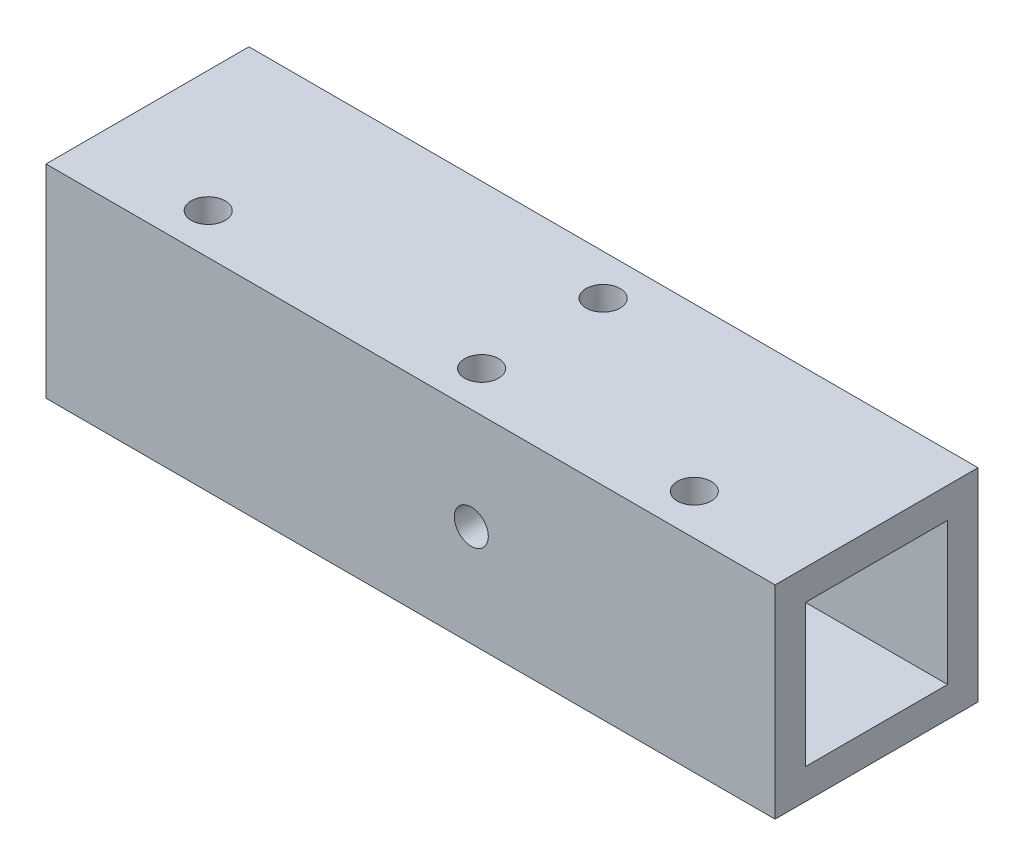
ISO-10303-21;
HEADER;
FILE_DESCRIPTION(('STEP AP214'),'2;1');
FILE_NAME('part.step','',(''),(''),'','','');
FILE_SCHEMA(('AUTOMOTIVE_DESIGN { 1 0 10303 214 1 1 1 1 }'));
ENDSEC;
DATA;
#1=APPLICATION_CONTEXT('core data for automotive mechanical design processes');
#2=APPLICATION_PROTOCOL_DEFINITION('international standard','automotive_design',2000,#1);
#3=PRODUCT_CONTEXT('',#1,'mechanical');
#4=PRODUCT('Part','Part','',(#3));
#5=PRODUCT_RELATED_PRODUCT_CATEGORY('part','',(#4));
#6=PRODUCT_DEFINITION_FORMATION('','',#4);
#7=PRODUCT_DEFINITION_CONTEXT('part definition',#1,'design');
#8=PRODUCT_DEFINITION('design','',#6,#7);
#9=PRODUCT_DEFINITION_SHAPE('','',#8);
#10=(LENGTH_UNIT() NAMED_UNIT(*) SI_UNIT(.MILLI.,.METRE.));
#11=(NAMED_UNIT(*) PLANE_ANGLE_UNIT() SI_UNIT($,.RADIAN.));
#12=(NAMED_UNIT(*) SI_UNIT($,.STERADIAN.) SOLID_ANGLE_UNIT());
#13=UNCERTAINTY_MEASURE_WITH_UNIT(LENGTH_MEASURE(1.E-05),#10,'distance_accuracy_value','');
#14=(GEOMETRIC_REPRESENTATION_CONTEXT(3) GLOBAL_UNCERTAINTY_ASSIGNED_CONTEXT((#13)) GLOBAL_UNIT_ASSIGNED_CONTEXT((#10,
#11,#12)) REPRESENTATION_CONTEXT('',''));
#15=CARTESIAN_POINT('',(0.,0.,0.));
#16=DIRECTION('',(0.,0.,1.));
#17=DIRECTION('',(1.,0.,0.));
#18=AXIS2_PLACEMENT_3D('',#15,#16,#17);
#19=CARTESIAN_POINT('',(29.,110.3,131.7));
#20=DIRECTION('',(0.,0.,1.));
#21=DIRECTION('',(1.,0.,0.));
#22=AXIS2_PLACEMENT_3D('',#19,#20,#21);
#23=PLANE('',#22);
#24=DIRECTION('',(0.,-1.,0.));
#25=VECTOR('',#24,1.);
#26=CARTESIAN_POINT('',(92.775140453871,144.,131.7));
#27=LINE('',#26,#25);
#28=CARTESIAN_POINT('',(92.77514045387,133.7,131.7));
#29=VERTEX_POINT('',#28);
#30=CARTESIAN_POINT('',(92.77514045387,110.3,131.7));
#31=VERTEX_POINT('',#30);
#32=EDGE_CURVE('E382',#29,#31,#27,.T.);
#33=ORIENTED_EDGE('',*,*,#32,.T.);
#34=DIRECTION('',(1.,0.,0.));
#35=VECTOR('',#34,1.);
#36=CARTESIAN_POINT('',(29.,110.3,131.7));
#37=LINE('',#36,#35);
#38=CARTESIAN_POINT('',(52.22485954613,110.3,131.7));
#39=VERTEX_POINT('',#38);
#40=EDGE_CURVE('E335',#39,#31,#37,.T.);
#41=ORIENTED_EDGE('',*,*,#40,.F.);
#42=DIRECTION('',(0.,-1.,0.));
#43=VECTOR('',#42,1.);
#44=CARTESIAN_POINT('',(52.224859546129,144.,131.7));
#45=LINE('',#44,#43);
#46=CARTESIAN_POINT('',(52.22485954613,133.7,131.7));
#47=VERTEX_POINT('',#46);
#48=EDGE_CURVE('E444',#47,#39,#45,.T.);
#49=ORIENTED_EDGE('',*,*,#48,.F.);
#50=DIRECTION('',(1.,0.,0.));
#51=VECTOR('',#50,1.);
#52=CARTESIAN_POINT('',(29.,133.7,131.7));
#53=LINE('',#52,#51);
#54=EDGE_CURVE('E354',#47,#29,#53,.T.);
#55=ORIENTED_EDGE('',*,*,#54,.T.);
#56=EDGE_LOOP('',(#33,#41,#49,#55));
#57=FACE_BOUND('',#56,.T.);
#58=ADVANCED_FACE('F16',(#57),#23,.F.);
#59=CARTESIAN_POINT('',(29.,110.3,131.7));
#60=DIRECTION('',(0.,0.,1.));
#61=DIRECTION('',(1.,0.,0.));
#62=AXIS2_PLACEMENT_3D('',#59,#60,#61);
#63=PLANE('',#62);
#64=DIRECTION('',(0.,-1.,0.));
#65=VECTOR('',#64,1.);
#66=CARTESIAN_POINT('',(127.77514045387,144.,131.7));
#67=LINE('',#66,#65);
#68=CARTESIAN_POINT('',(127.77514045387,133.7,131.7));
#69=VERTEX_POINT('',#68);
#70=CARTESIAN_POINT('',(127.77514045387,110.3,131.7));
#71=VERTEX_POINT('',#70);
#72=EDGE_CURVE('E292',#69,#71,#67,.T.);
#73=ORIENTED_EDGE('',*,*,#72,.T.);
#74=DIRECTION('',(1.,0.,0.));
#75=VECTOR('',#74,1.);
#76=CARTESIAN_POINT('',(29.,110.3,131.7));
#77=LINE('',#76,#75);
#78=CARTESIAN_POINT('',(97.22485954613,110.3,131.7));
#79=VERTEX_POINT('',#78);
#80=EDGE_CURVE('E265',#79,#71,#77,.T.);
#81=ORIENTED_EDGE('',*,*,#80,.F.);
#82=DIRECTION('',(0.,-1.,0.));
#83=VECTOR('',#82,1.);
#84=CARTESIAN_POINT('',(97.224859546129,144.,131.7));
#85=LINE('',#84,#83);
#86=CARTESIAN_POINT('',(97.224859545156,121.62771591443,131.69999999998));
#87=VERTEX_POINT('',#86);
#88=EDGE_CURVE('E262',#87,#79,#85,.T.);
#89=ORIENTED_EDGE('',*,*,#88,.F.);
#90=CARTESIAN_POINT('',(100.,122.,131.7));
#91=DIRECTION('',(0.,0.,1.));
#92=DIRECTION('',(1.,0.,0.));
#93=AXIS2_PLACEMENT_3D('',#90,#91,#92);
#94=CIRCLE('',#93,2.8);
#95=CARTESIAN_POINT('',(102.8,122.,131.7));
#96=VERTEX_POINT('',#95);
#97=EDGE_CURVE('E249',#87,#96,#94,.T.);
#98=ORIENTED_EDGE('',*,*,#97,.T.);
#99=CARTESIAN_POINT('',(100.,122.,131.7));
#100=DIRECTION('',(0.,0.,1.));
#101=DIRECTION('',(1.,0.,0.));
#102=AXIS2_PLACEMENT_3D('',#99,#100,#101);
#103=CIRCLE('',#102,2.8);
#104=CARTESIAN_POINT('',(97.224859545159,122.37228408554,131.69999999998));
#105=VERTEX_POINT('',#104);
#106=EDGE_CURVE('E259',#96,#105,#103,.T.);
#107=ORIENTED_EDGE('',*,*,#106,.T.);
#108=DIRECTION('',(0.,-1.,0.));
#109=VECTOR('',#108,1.);
#110=CARTESIAN_POINT('',(97.224859546129,144.,131.7));
#111=LINE('',#110,#109);
#112=CARTESIAN_POINT('',(97.22485954613,133.7,131.7));
#113=VERTEX_POINT('',#112);
#114=EDGE_CURVE('E274',#113,#105,#111,.T.);
#115=ORIENTED_EDGE('',*,*,#114,.F.);
#116=DIRECTION('',(1.,0.,0.));
#117=VECTOR('',#116,1.);
#118=CARTESIAN_POINT('',(29.,133.7,131.7));
#119=LINE('',#118,#117);
#120=EDGE_CURVE('E375',#113,#69,#119,.T.);
#121=ORIENTED_EDGE('',*,*,#120,.T.);
#122=EDGE_LOOP('',(#73,#81,#89,#98,#107,#115,#121));
#123=FACE_BOUND('',#122,.T.);
#124=ADVANCED_FACE('F263',(#123),#63,.F.);
#125=CARTESIAN_POINT('',(29.,110.3,131.7));
#126=DIRECTION('',(0.,0.,1.));
#127=DIRECTION('',(1.,0.,0.));
#128=AXIS2_PLACEMENT_3D('',#125,#126,#127);
#129=PLANE('',#128);
#130=DIRECTION('',(0.,-1.,0.));
#131=VECTOR('',#130,1.);
#132=CARTESIAN_POINT('',(150.,107.8,131.7));
#133=LINE('',#132,#131);
#134=CARTESIAN_POINT('',(150.,133.7,131.7));
#135=VERTEX_POINT('',#134);
#136=CARTESIAN_POINT('',(150.,110.3,131.7));
#137=VERTEX_POINT('',#136);
#138=EDGE_CURVE('E393',#135,#137,#133,.T.);
#139=ORIENTED_EDGE('',*,*,#138,.T.);
#140=DIRECTION('',(1.,0.,0.));
#141=VECTOR('',#140,1.);
#142=CARTESIAN_POINT('',(29.,110.3,131.7));
#143=LINE('',#142,#141);
#144=CARTESIAN_POINT('',(132.22485954613,110.3,131.7));
#145=VERTEX_POINT('',#144);
#146=EDGE_CURVE('E344',#145,#137,#143,.T.);
#147=ORIENTED_EDGE('',*,*,#146,.F.);
#148=DIRECTION('',(0.,-1.,0.));
#149=VECTOR('',#148,1.);
#150=CARTESIAN_POINT('',(132.22485954612,144.,131.7));
#151=LINE('',#150,#149);
#152=CARTESIAN_POINT('',(132.22485954613,133.7,131.7));
#153=VERTEX_POINT('',#152);
#154=EDGE_CURVE('E297',#153,#145,#151,.T.);
#155=ORIENTED_EDGE('',*,*,#154,.F.);
#156=DIRECTION('',(1.,0.,0.));
#157=VECTOR('',#156,1.);
#158=CARTESIAN_POINT('',(29.,133.7,131.7));
#159=LINE('',#158,#157);
#160=EDGE_CURVE('E366',#153,#135,#159,.T.);
#161=ORIENTED_EDGE('',*,*,#160,.T.);
#162=EDGE_LOOP('',(#139,#147,#155,#161));
#163=FACE_BOUND('',#162,.T.);
#164=ADVANCED_FACE('F654',(#163),#129,.F.);
#165=CARTESIAN_POINT('',(29.,110.3,108.3));
#166=DIRECTION('',(0.,0.,1.));
#167=DIRECTION('',(1.,0.,0.));
#168=AXIS2_PLACEMENT_3D('',#165,#166,#167);
#169=PLANE('',#168);
#170=DIRECTION('',(1.,0.,0.));
#171=VECTOR('',#170,1.);
#172=CARTESIAN_POINT('',(29.,133.7,108.3));
#173=LINE('',#172,#171);
#174=CARTESIAN_POINT('',(97.22485954613,133.7,108.3));
#175=VERTEX_POINT('',#174);
#176=CARTESIAN_POINT('',(150.,133.7,108.3));
#177=VERTEX_POINT('',#176);
#178=EDGE_CURVE('E358',#175,#177,#173,.T.);
#179=ORIENTED_EDGE('',*,*,#178,.F.);
#180=DIRECTION('',(0.,-1.,0.));
#181=VECTOR('',#180,1.);
#182=CARTESIAN_POINT('',(97.224859546129,144.,108.3));
#183=LINE('',#182,#181);
#184=CARTESIAN_POINT('',(97.22485954516,122.37228408556,108.30000000001));
#185=VERTEX_POINT('',#184);
#186=EDGE_CURVE('E462',#175,#185,#183,.T.);
#187=ORIENTED_EDGE('',*,*,#186,.T.);
#188=CARTESIAN_POINT('',(100.,122.,108.3));
#189=DIRECTION('',(0.,0.,1.));
#190=DIRECTION('',(1.,0.,0.));
#191=AXIS2_PLACEMENT_3D('',#188,#189,#190);
#192=CIRCLE('',#191,2.8);
#193=CARTESIAN_POINT('',(102.8,122.,108.3));
#194=VERTEX_POINT('',#193);
#195=EDGE_CURVE('E11',#194,#185,#192,.T.);
#196=ORIENTED_EDGE('',*,*,#195,.F.);
#197=CARTESIAN_POINT('',(100.,122.,108.3));
#198=DIRECTION('',(0.,0.,1.));
#199=DIRECTION('',(1.,0.,0.));
#200=AXIS2_PLACEMENT_3D('',#197,#198,#199);
#201=CIRCLE('',#200,2.8);
#202=CARTESIAN_POINT('',(97.224859545153,121.62771591445,108.30000000001));
#203=VERTEX_POINT('',#202);
#204=EDGE_CURVE('E301',#203,#194,#201,.T.);
#205=ORIENTED_EDGE('',*,*,#204,.F.);
#206=DIRECTION('',(0.,-1.,0.));
#207=VECTOR('',#206,1.);
#208=CARTESIAN_POINT('',(97.224859546129,144.,108.3));
#209=LINE('',#208,#207);
#210=CARTESIAN_POINT('',(97.22485954613,110.3,108.3));
#211=VERTEX_POINT('',#210);
#212=EDGE_CURVE('E452',#203,#211,#209,.T.);
#213=ORIENTED_EDGE('',*,*,#212,.T.);
#214=DIRECTION('',(1.,0.,0.));
#215=VECTOR('',#214,1.);
#216=CARTESIAN_POINT('',(29.,110.3,108.3));
#217=LINE('',#216,#215);
#218=CARTESIAN_POINT('',(150.,110.3,108.3));
#219=VERTEX_POINT('',#218);
#220=EDGE_CURVE('E435',#211,#219,#217,.T.);
#221=ORIENTED_EDGE('',*,*,#220,.T.);
#222=DIRECTION('',(0.,-1.,0.));
#223=VECTOR('',#222,1.);
#224=CARTESIAN_POINT('',(150.,107.8,108.3));
#225=LINE('',#224,#223);
#226=EDGE_CURVE('E402',#177,#219,#225,.T.);
#227=ORIENTED_EDGE('',*,*,#226,.F.);
#228=EDGE_LOOP('',(#179,#187,#196,#205,#213,#221,#227));
#229=FACE_BOUND('',#228,.T.);
#230=ADVANCED_FACE('F695',(#229),#169,.T.);
#231=CARTESIAN_POINT('',(100.,122.,98.));
#232=DIRECTION('',(0.,0.,1.));
#233=DIRECTION('',(1.,0.,0.));
#234=AXIS2_PLACEMENT_3D('',#231,#232,#233);
#235=CYLINDRICAL_SURFACE('',#234,2.8);
#236=CARTESIAN_POINT('',(97.8,123.73205080756,110.));
#237=CARTESIAN_POINT('',(97.8,123.73205080756,109.85041964178));
#238=CARTESIAN_POINT('',(97.790011829092,123.71936303082,109.70056829238));
#239=CARTESIAN_POINT('',(97.769961029832,123.69390053586,109.55275359264));
#240=CARTESIAN_POINT('',(97.740657571121,123.65515602279,109.40924354294));
#241=CARTESIAN_POINT('',(97.692257164637,123.58578796311,109.22948646698));
#242=CARTESIAN_POINT('',(97.680079309427,123.56802231367,109.18758959465));
#243=CARTESIAN_POINT('',(97.66723267084,123.54888970784,109.14641091507));
#244=CARTESIAN_POINT('',(97.653784659912,123.52838085207,109.10602932831));
#245=CARTESIAN_POINT('',(97.614168979038,123.46631574462,108.99399967765));
#246=CARTESIAN_POINT('',(97.586748704889,123.42147213521,108.92437940356));
#247=CARTESIAN_POINT('',(97.55806652263,123.37199304655,108.85823329276));
#248=CARTESIAN_POINT('',(97.528750923776,123.31801920484,108.79598579798));
#249=CARTESIAN_POINT('',(97.470087623726,123.20158078889,108.67980874713));
#250=CARTESIAN_POINT('',(97.440765231716,123.13916026401,108.6259358));
#251=CARTESIAN_POINT('',(97.412092557372,123.07284485718,108.57656898486));
#252=CARTESIAN_POINT('',(97.384698099232,123.00306149519,108.53184671004));
#253=CARTESIAN_POINT('',(97.345314443017,122.89127150685,108.47024353929));
#254=CARTESIAN_POINT('',(97.332047382514,122.85130171597,108.4500343796));
#255=CARTESIAN_POINT('',(97.319371634579,122.81055897365,108.43117181344));
#256=CARTESIAN_POINT('',(97.30735218674,122.76911947962,108.41364683849));
#257=CARTESIAN_POINT('',(97.284298899401,122.68338347064,108.38061753947));
#258=CARTESIAN_POINT('',(97.273320701867,122.63903803082,108.36521721842));
#259=CARTESIAN_POINT('',(97.263167391414,122.59410574017,108.35122378277));
#260=CARTESIAN_POINT('',(97.253886373651,122.54866593538,108.3386172347));
#261=CARTESIAN_POINT('',(97.22762318304,122.40478666829,108.30335866083));
#262=CARTESIAN_POINT('',(97.213887228453,122.30485982352,108.28558827161));
#263=CARTESIAN_POINT('',(97.204627032878,122.20364797545,108.27382632774));
#264=CARTESIAN_POINT('',(97.2,122.10180534585,108.26794919243));
#265=CARTESIAN_POINT('',(97.2,121.89799108939,108.26794919243));
#266=CARTESIAN_POINT('',(97.204645556112,121.79594450795,108.27384985592));
#267=CARTESIAN_POINT('',(97.213942874611,121.69453256029,108.28565894961));
#268=CARTESIAN_POINT('',(97.227733245734,121.59441354719,108.30350105795));
#269=CARTESIAN_POINT('',(97.254062756517,121.45046096073,108.33885656942));
#270=CARTESIAN_POINT('',(97.263336661878,121.40512730239,108.35145632141));
#271=CARTESIAN_POINT('',(97.27347859811,121.36029978811,108.36543716297));
#272=CARTESIAN_POINT('',(97.284441392189,121.31605726587,108.38081895241));
#273=CARTESIAN_POINT('',(97.307446018876,121.23056007546,108.41378394153));
#274=CARTESIAN_POINT('',(97.319431083706,121.18925543608,108.43126098712));
#275=CARTESIAN_POINT('',(97.332068079063,121.14864340955,108.45006720995));
#276=CARTESIAN_POINT('',(97.345292617652,121.10879947806,108.47021152037));
#277=CARTESIAN_POINT('',(97.384518612931,120.99743127385,108.53156204201));
#278=CARTESIAN_POINT('',(97.411786485551,120.92792451712,108.57606536445));
#279=CARTESIAN_POINT('',(97.440324793625,120.86185323703,108.62517414753));
#280=CARTESIAN_POINT('',(97.469513683019,120.79963951286,108.67875252345));
#281=CARTESIAN_POINT('',(97.528135682511,120.68312225833,108.79468835621));
#282=CARTESIAN_POINT('',(97.557543792703,120.62892210957,108.85704909301));
#283=CARTESIAN_POINT('',(97.586322217985,120.57924036173,108.92333552856));
#284=CARTESIAN_POINT('',(97.61383633456,120.53421999952,108.99312024851));
#285=CARTESIAN_POINT('',(97.653224547554,120.47248902247,109.10441330576));
#286=CARTESIAN_POINT('',(97.666384960605,120.45239892166,109.14384139588));
#287=CARTESIAN_POINT('',(97.678972701686,120.43362433868,109.18402954956));
#288=CARTESIAN_POINT('',(97.69092448028,120.41615696366,109.22490414568));
#289=CARTESIAN_POINT('',(97.739691030679,120.34612255498,109.4045320379));
#290=CARTESIAN_POINT('',(97.769464483038,120.30672988046,109.54911015633));
#291=CARTESIAN_POINT('',(97.789847422043,120.2808458769,109.69810626183));
#292=CARTESIAN_POINT('',(97.8,120.26794919243,109.84919345422));
#293=CARTESIAN_POINT('',(97.8,120.26794919243,110.));
#294=(BOUNDED_CURVE() B_SPLINE_CURVE(5,(#236,#237,#238,#239,#240,#241,#242,#243,#244,#245,#246,
#247,#248,#249,#250,#251,#252,#253,#254,#255,#256,#257,#258,#259,#260,#261,#262,#263,#264,#265,
#266,#267,#268,#269,#270,#271,#272,#273,#274,#275,#276,#277,#278,#279,#280,#281,#282,#283,#284,
#285,#286,#287,#288,#289,#290,#291,#292,#293),.UNSPECIFIED.,.F.,
.F.) B_SPLINE_CURVE_WITH_KNOTS((6,4,4,4,4,4,4,4,4,4,4,4,4,4,6),(0.,0.133260040199,
0.174557906728,0.25034775039,0.326194708021,0.367024722464,0.409421854425,0.500004786214,
0.590768842992,0.633073733273,0.673774653268,0.749300311701,0.825305972159,0.865654665322,1.),
.UNSPECIFIED.) CURVE() GEOMETRIC_REPRESENTATION_ITEM() RATIONAL_B_SPLINE_CURVE((1.,1.,1.,1.,1.,
1.,1.,1.,1.,1.,1.,1.,1.,1.,1.,1.,1.,1.,1.,1.,1.,1.,1.,1.,1.,1.,1.,1.,1.,1.,1.,1.,1.,1.,1.,1.,1.,
1.,1.,1.,1.,1.,1.,1.,1.,1.,1.,1.,1.,1.,1.,1.,1.,1.,1.,1.,1.,1.)) REPRESENTATION_ITEM(''));
#295=EDGE_CURVE('E458',#185,#203,#294,.T.);
#296=ORIENTED_EDGE('',*,*,#295,.T.);
#297=ORIENTED_EDGE('',*,*,#204,.T.);
#298=DIRECTION('',(0.,0.,1.));
#299=VECTOR('',#298,1.);
#300=CARTESIAN_POINT('',(102.8,122.,98.));
#301=LINE('',#300,#299);
#302=CARTESIAN_POINT('',(102.8,122.,103.3));
#303=VERTEX_POINT('',#302);
#304=EDGE_CURVE('E25',#303,#194,#301,.T.);
#305=ORIENTED_EDGE('',*,*,#304,.F.);
#306=CARTESIAN_POINT('',(100.,122.,103.3));
#307=DIRECTION('',(0.,0.,1.));
#308=DIRECTION('',(1.,0.,0.));
#309=AXIS2_PLACEMENT_3D('',#306,#307,#308);
#310=CIRCLE('',#309,2.8);
#311=EDGE_CURVE('E499',#303,#303,#310,.T.);
#312=ORIENTED_EDGE('',*,*,#311,.F.);
#313=ORIENTED_EDGE('',*,*,#304,.T.);
#314=ORIENTED_EDGE('',*,*,#195,.T.);
#315=EDGE_LOOP('',(#296,#297,#305,#312,#313,#314));
#316=FACE_BOUND('',#315,.T.);
#317=ADVANCED_FACE('F705',(#316),#235,.F.);
#318=CARTESIAN_POINT('',(100.,122.,98.));
#319=DIRECTION('',(0.,0.,1.));
#320=DIRECTION('',(1.,0.,0.));
#321=AXIS2_PLACEMENT_3D('',#318,#319,#320);
#322=CYLINDRICAL_SURFACE('',#321,2.8);
#323=DIRECTION('',(0.,0.,1.));
#324=VECTOR('',#323,1.);
#325=CARTESIAN_POINT('',(102.8,122.,98.));
#326=LINE('',#325,#324);
#327=CARTESIAN_POINT('',(102.8,122.,136.7));
#328=VERTEX_POINT('',#327);
#329=EDGE_CURVE('E256',#96,#328,#326,.T.);
#330=ORIENTED_EDGE('',*,*,#329,.F.);
#331=ORIENTED_EDGE('',*,*,#97,.F.);
#332=CARTESIAN_POINT('',(97.8,123.73205080756,130.));
#333=CARTESIAN_POINT('',(97.8,123.73205080756,130.14958035821));
#334=CARTESIAN_POINT('',(97.790011829091,123.71936303082,130.29943170761));
#335=CARTESIAN_POINT('',(97.769961029832,123.69390053586,130.44724640735));
#336=CARTESIAN_POINT('',(97.740657571121,123.65515602279,130.59075645705));
#337=CARTESIAN_POINT('',(97.692257164637,123.58578796311,130.77051353301));
#338=CARTESIAN_POINT('',(97.680079309427,123.56802231367,130.81241040534));
#339=CARTESIAN_POINT('',(97.66723267084,123.54888970784,130.85358908492));
#340=CARTESIAN_POINT('',(97.653784659912,123.52838085208,130.89397067168));
#341=CARTESIAN_POINT('',(97.614168979038,123.46631574462,131.00600032234));
#342=CARTESIAN_POINT('',(97.586748704889,123.42147213521,131.07562059643));
#343=CARTESIAN_POINT('',(97.55806652263,123.37199304655,131.14176670723));
#344=CARTESIAN_POINT('',(97.528750923776,123.31801920484,131.20401420201));
#345=CARTESIAN_POINT('',(97.470087623727,123.20158078889,131.32019125286));
#346=CARTESIAN_POINT('',(97.440765231716,123.13916026401,131.37406419999));
#347=CARTESIAN_POINT('',(97.412092557372,123.07284485718,131.42343101513));
#348=CARTESIAN_POINT('',(97.384698099232,123.00306149519,131.46815328995));
#349=CARTESIAN_POINT('',(97.345314443017,122.89127150685,131.5297564607));
#350=CARTESIAN_POINT('',(97.332047382514,122.85130171597,131.54996562039));
#351=CARTESIAN_POINT('',(97.319371634579,122.81055897365,131.56882818655));
#352=CARTESIAN_POINT('',(97.30735218674,122.76911947962,131.5863531615));
#353=CARTESIAN_POINT('',(97.284298899401,122.68338347064,131.61938246052));
#354=CARTESIAN_POINT('',(97.273320701867,122.63903803082,131.63478278157));
#355=CARTESIAN_POINT('',(97.263167391414,122.59410574017,131.64877621722));
#356=CARTESIAN_POINT('',(97.253886373651,122.54866593538,131.66138276529));
#357=CARTESIAN_POINT('',(97.22762318304,122.40478666829,131.69664133917));
#358=CARTESIAN_POINT('',(97.213887228454,122.30485982353,131.71441172838));
#359=CARTESIAN_POINT('',(97.204627032878,122.20364797545,131.72617367225));
#360=CARTESIAN_POINT('',(97.2,122.10180534585,131.73205080756));
#361=CARTESIAN_POINT('',(97.2,121.89799108939,131.73205080756));
#362=CARTESIAN_POINT('',(97.204645556113,121.79594450795,131.72615014407));
#363=CARTESIAN_POINT('',(97.213942874611,121.69453256029,131.71434105038));
#364=CARTESIAN_POINT('',(97.227733245734,121.59441354719,131.69649894204));
#365=CARTESIAN_POINT('',(97.254062756517,121.45046096073,131.66114343058));
#366=CARTESIAN_POINT('',(97.263336661878,121.40512730239,131.64854367858));
#367=CARTESIAN_POINT('',(97.27347859811,121.36029978811,131.63456283702));
#368=CARTESIAN_POINT('',(97.284441392189,121.31605726587,131.61918104758));
#369=CARTESIAN_POINT('',(97.307446018876,121.23056007546,131.58621605846));
#370=CARTESIAN_POINT('',(97.319431083706,121.18925543608,131.56873901287));
#371=CARTESIAN_POINT('',(97.332068079063,121.14864340955,131.54993279004));
#372=CARTESIAN_POINT('',(97.345292617652,121.10879947806,131.52978847962));
#373=CARTESIAN_POINT('',(97.384518612931,120.99743127385,131.46843795798));
#374=CARTESIAN_POINT('',(97.411786485551,120.92792451712,131.42393463554));
#375=CARTESIAN_POINT('',(97.440324793625,120.86185323703,131.37482585246));
#376=CARTESIAN_POINT('',(97.469513683019,120.79963951286,131.32124747654));
#377=CARTESIAN_POINT('',(97.528135682511,120.68312225833,131.20531164379));
#378=CARTESIAN_POINT('',(97.557543792703,120.62892210957,131.14295090698));
#379=CARTESIAN_POINT('',(97.586322217985,120.57924036173,131.07666447143));
#380=CARTESIAN_POINT('',(97.61383633456,120.53421999952,131.00687975148));
#381=CARTESIAN_POINT('',(97.653224547554,120.47248902247,130.89558669423));
#382=CARTESIAN_POINT('',(97.666384960605,120.45239892166,130.85615860411));
#383=CARTESIAN_POINT('',(97.678972701686,120.43362433868,130.81597045043));
#384=CARTESIAN_POINT('',(97.69092448028,120.41615696366,130.77509585431));
#385=CARTESIAN_POINT('',(97.739691030697,120.34612255495,130.59546796203));
#386=CARTESIAN_POINT('',(97.769464483012,120.30672988049,130.45088984372));
#387=CARTESIAN_POINT('',(97.789847422052,120.28084587689,130.30189373824));
#388=CARTESIAN_POINT('',(97.8,120.26794919243,130.15080654569));
#389=CARTESIAN_POINT('',(97.8,120.26794919243,130.));
#390=(BOUNDED_CURVE() B_SPLINE_CURVE(5,(#332,#333,#334,#335,#336,#337,#338,#339,#340,#341,#342,
#343,#344,#345,#346,#347,#348,#349,#350,#351,#352,#353,#354,#355,#356,#357,#358,#359,#360,#361,
#362,#363,#364,#365,#366,#367,#368,#369,#370,#371,#372,#373,#374,#375,#376,#377,#378,#379,#380,
#381,#382,#383,#384,#385,#386,#387,#388,#389),.UNSPECIFIED.,.F.,
.F.) B_SPLINE_CURVE_WITH_KNOTS((6,4,4,4,4,4,4,4,4,4,4,4,4,4,6),(0.,0.133260040189,
0.174557906715,0.250347750371,0.326194707996,0.367024722435,0.409421854393,0.500004786175,
0.590768842948,0.633073733227,0.673774653221,0.749300311651,0.825305972105,0.865654665266,1.),
.UNSPECIFIED.) CURVE() GEOMETRIC_REPRESENTATION_ITEM() RATIONAL_B_SPLINE_CURVE((1.,1.,1.,1.,1.,
1.,1.,1.,1.,1.,1.,1.,1.,1.,1.,1.,1.,1.,1.,1.,1.,1.,1.,1.,1.,1.,1.,1.,1.,1.,1.,1.,1.,1.,1.,1.,1.,
1.,1.,1.,1.,1.,1.,1.,1.,1.,1.,1.,1.,1.,1.,1.,1.,1.,1.,1.,1.,1.)) REPRESENTATION_ITEM(''));
#391=EDGE_CURVE('E253',#105,#87,#390,.T.);
#392=ORIENTED_EDGE('',*,*,#391,.F.);
#393=ORIENTED_EDGE('',*,*,#106,.F.);
#394=ORIENTED_EDGE('',*,*,#329,.T.);
#395=CARTESIAN_POINT('',(100.,122.,136.7));
#396=DIRECTION('',(0.,0.,1.));
#397=DIRECTION('',(1.,0.,0.));
#398=AXIS2_PLACEMENT_3D('',#395,#396,#397);
#399=CIRCLE('',#398,2.8);
#400=EDGE_CURVE('E532',#328,#328,#399,.T.);
#401=ORIENTED_EDGE('',*,*,#400,.T.);
#402=EDGE_LOOP('',(#330,#331,#392,#393,#394,#401));
#403=FACE_BOUND('',#402,.T.);
#404=ADVANCED_FACE('F251',(#403),#322,.F.);
#405=CARTESIAN_POINT('',(130.,144.,130.));
#406=DIRECTION('',(0.,-1.,0.));
#407=DIRECTION('',(1.,0.,0.));
#408=AXIS2_PLACEMENT_3D('',#405,#406,#407);
#409=CYLINDRICAL_SURFACE('',#408,2.8);
#410=DIRECTION('',(0.,-1.,0.));
#411=VECTOR('',#410,1.);
#412=CARTESIAN_POINT('',(132.8,144.,130.));
#413=LINE('',#412,#411);
#414=CARTESIAN_POINT('',(132.8,110.3,130.));
#415=VERTEX_POINT('',#414);
#416=CARTESIAN_POINT('',(132.8,105.3,130.));
#417=VERTEX_POINT('',#416);
#418=EDGE_CURVE('E270',#415,#417,#413,.T.);
#419=ORIENTED_EDGE('',*,*,#418,.F.);
#420=CARTESIAN_POINT('',(130.,110.3,130.));
#421=DIRECTION('',(0.,-1.,0.));
#422=DIRECTION('',(1.,0.,0.));
#423=AXIS2_PLACEMENT_3D('',#420,#421,#422);
#424=CIRCLE('',#423,2.8);
#425=EDGE_CURVE('E345',#71,#415,#424,.T.);
#426=ORIENTED_EDGE('',*,*,#425,.F.);
#427=ORIENTED_EDGE('',*,*,#72,.F.);
#428=CARTESIAN_POINT('',(130.,133.7,130.));
#429=DIRECTION('',(0.,-1.,0.));
#430=DIRECTION('',(1.,0.,0.));
#431=AXIS2_PLACEMENT_3D('',#428,#429,#430);
#432=CIRCLE('',#431,2.8);
#433=CARTESIAN_POINT('',(132.8,133.7,130.));
#434=VERTEX_POINT('',#433);
#435=EDGE_CURVE('E379',#69,#434,#432,.T.);
#436=ORIENTED_EDGE('',*,*,#435,.T.);
#437=DIRECTION('',(0.,-1.,0.));
#438=VECTOR('',#437,1.);
#439=CARTESIAN_POINT('',(132.8,144.,130.));
#440=LINE('',#439,#438);
#441=CARTESIAN_POINT('',(132.8,138.7,130.));
#442=VERTEX_POINT('',#441);
#443=EDGE_CURVE('E294',#442,#434,#440,.T.);
#444=ORIENTED_EDGE('',*,*,#443,.F.);
#445=CARTESIAN_POINT('',(130.,138.7,130.));
#446=DIRECTION('',(0.,-1.,0.));
#447=DIRECTION('',(1.,0.,0.));
#448=AXIS2_PLACEMENT_3D('',#445,#446,#447);
#449=CIRCLE('',#448,2.8);
#450=EDGE_CURVE('E319',#442,#442,#449,.T.);
#451=ORIENTED_EDGE('',*,*,#450,.F.);
#452=ORIENTED_EDGE('',*,*,#443,.T.);
#453=CARTESIAN_POINT('',(130.,133.7,130.));
#454=DIRECTION('',(0.,-1.,0.));
#455=DIRECTION('',(1.,0.,0.));
#456=AXIS2_PLACEMENT_3D('',#453,#454,#455);
#457=CIRCLE('',#456,2.8);
#458=EDGE_CURVE('E370',#434,#153,#457,.T.);
#459=ORIENTED_EDGE('',*,*,#458,.T.);
#460=ORIENTED_EDGE('',*,*,#154,.T.);
#461=CARTESIAN_POINT('',(130.,110.3,130.));
#462=DIRECTION('',(0.,-1.,0.));
#463=DIRECTION('',(1.,0.,0.));
#464=AXIS2_PLACEMENT_3D('',#461,#462,#463);
#465=CIRCLE('',#464,2.8);
#466=EDGE_CURVE('E340',#415,#145,#465,.T.);
#467=ORIENTED_EDGE('',*,*,#466,.F.);
#468=ORIENTED_EDGE('',*,*,#418,.T.);
#469=CARTESIAN_POINT('',(130.,105.3,130.));
#470=DIRECTION('',(0.,-1.,0.));
#471=DIRECTION('',(1.,0.,0.));
#472=AXIS2_PLACEMENT_3D('',#469,#470,#471);
#473=CIRCLE('',#472,2.8);
#474=EDGE_CURVE('E558',#417,#417,#473,.T.);
#475=ORIENTED_EDGE('',*,*,#474,.T.);
#476=EDGE_LOOP('',(#419,#426,#427,#436,#444,#451,#452,#459,#460,#467,#468,#475));
#477=FACE_BOUND('',#476,.T.);
#478=ADVANCED_FACE('F671',(#477),#409,.F.);
#479=CARTESIAN_POINT('',(95.,144.,130.));
#480=DIRECTION('',(0.,-1.,0.));
#481=DIRECTION('',(1.,0.,0.));
#482=AXIS2_PLACEMENT_3D('',#479,#480,#481);
#483=CYLINDRICAL_SURFACE('',#482,2.8);
#484=DIRECTION('',(0.,-1.,0.));
#485=VECTOR('',#484,1.);
#486=CARTESIAN_POINT('',(97.8,144.,130.));
#487=LINE('',#486,#485);
#488=CARTESIAN_POINT('',(97.8,110.3,130.));
#489=VERTEX_POINT('',#488);
#490=CARTESIAN_POINT('',(97.8,105.3,130.));
#491=VERTEX_POINT('',#490);
#492=EDGE_CURVE('E453',#489,#491,#487,.T.);
#493=ORIENTED_EDGE('',*,*,#492,.F.);
#494=CARTESIAN_POINT('',(95.,110.3,130.));
#495=DIRECTION('',(0.,-1.,0.));
#496=DIRECTION('',(1.,0.,0.));
#497=AXIS2_PLACEMENT_3D('',#494,#495,#496);
#498=CIRCLE('',#497,2.8);
#499=EDGE_CURVE('E330',#31,#489,#498,.T.);
#500=ORIENTED_EDGE('',*,*,#499,.F.);
#501=ORIENTED_EDGE('',*,*,#32,.F.);
#502=CARTESIAN_POINT('',(95.,133.7,130.));
#503=DIRECTION('',(0.,-1.,0.));
#504=DIRECTION('',(1.,0.,0.));
#505=AXIS2_PLACEMENT_3D('',#502,#503,#504);
#506=CIRCLE('',#505,2.8);
#507=CARTESIAN_POINT('',(97.8,133.7,130.));
#508=VERTEX_POINT('',#507);
#509=EDGE_CURVE('E374',#29,#508,#506,.T.);
#510=ORIENTED_EDGE('',*,*,#509,.T.);
#511=DIRECTION('',(0.,-1.,0.));
#512=VECTOR('',#511,1.);
#513=CARTESIAN_POINT('',(97.8,144.,130.));
#514=LINE('',#513,#512);
#515=CARTESIAN_POINT('',(97.8,138.7,130.));
#516=VERTEX_POINT('',#515);
#517=EDGE_CURVE('E280',#516,#508,#514,.T.);
#518=ORIENTED_EDGE('',*,*,#517,.F.);
#519=CARTESIAN_POINT('',(95.,138.7,130.));
#520=DIRECTION('',(0.,-1.,0.));
#521=DIRECTION('',(1.,0.,0.));
#522=AXIS2_PLACEMENT_3D('',#519,#520,#521);
#523=CIRCLE('',#522,2.8);
#524=EDGE_CURVE('E317',#516,#516,#523,.T.);
#525=ORIENTED_EDGE('',*,*,#524,.F.);
#526=ORIENTED_EDGE('',*,*,#517,.T.);
#527=CARTESIAN_POINT('',(95.,133.7,130.));
#528=DIRECTION('',(0.,-1.,0.));
#529=DIRECTION('',(1.,0.,0.));
#530=AXIS2_PLACEMENT_3D('',#527,#528,#529);
#531=CIRCLE('',#530,2.8);
#532=EDGE_CURVE('E371',#508,#113,#531,.T.);
#533=ORIENTED_EDGE('',*,*,#532,.T.);
#534=ORIENTED_EDGE('',*,*,#114,.T.);
#535=ORIENTED_EDGE('',*,*,#391,.T.);
#536=ORIENTED_EDGE('',*,*,#88,.T.);
#537=CARTESIAN_POINT('',(95.,110.3,130.));
#538=DIRECTION('',(0.,-1.,0.));
#539=DIRECTION('',(1.,0.,0.));
#540=AXIS2_PLACEMENT_3D('',#537,#538,#539);
#541=CIRCLE('',#540,2.8);
#542=EDGE_CURVE('E334',#489,#79,#541,.T.);
#543=ORIENTED_EDGE('',*,*,#542,.F.);
#544=ORIENTED_EDGE('',*,*,#492,.T.);
#545=CARTESIAN_POINT('',(95.,105.3,130.));
#546=DIRECTION('',(0.,-1.,0.));
#547=DIRECTION('',(1.,0.,0.));
#548=AXIS2_PLACEMENT_3D('',#545,#546,#547);
#549=CIRCLE('',#548,2.8);
#550=EDGE_CURVE('E563',#491,#491,#549,.T.);
#551=ORIENTED_EDGE('',*,*,#550,.T.);
#552=EDGE_LOOP('',(#493,#500,#501,#510,#518,#525,#526,#533,#534,#535,#536,#543,#544,#551));
#553=FACE_BOUND('',#552,.T.);
#554=ADVANCED_FACE('F272',(#553),#483,.F.);
#555=CARTESIAN_POINT('',(95.,144.,110.));
#556=DIRECTION('',(0.,-1.,0.));
#557=DIRECTION('',(1.,0.,0.));
#558=AXIS2_PLACEMENT_3D('',#555,#556,#557);
#559=CYLINDRICAL_SURFACE('',#558,2.8);
#560=DIRECTION('',(0.,-1.,0.));
#561=VECTOR('',#560,1.);
#562=CARTESIAN_POINT('',(97.8,144.,110.));
#563=LINE('',#562,#561);
#564=CARTESIAN_POINT('',(97.8,110.3,110.));
#565=VERTEX_POINT('',#564);
#566=CARTESIAN_POINT('',(97.8,105.3,110.));
#567=VERTEX_POINT('',#566);
#568=EDGE_CURVE('E449',#565,#567,#563,.T.);
#569=ORIENTED_EDGE('',*,*,#568,.F.);
#570=CARTESIAN_POINT('',(95.,110.3,110.));
#571=DIRECTION('',(0.,-1.,0.));
#572=DIRECTION('',(1.,0.,0.));
#573=AXIS2_PLACEMENT_3D('',#570,#571,#572);
#574=CIRCLE('',#573,2.8);
#575=EDGE_CURVE('E436',#211,#565,#574,.T.);
#576=ORIENTED_EDGE('',*,*,#575,.F.);
#577=ORIENTED_EDGE('',*,*,#212,.F.);
#578=ORIENTED_EDGE('',*,*,#295,.F.);
#579=ORIENTED_EDGE('',*,*,#186,.F.);
#580=CARTESIAN_POINT('',(95.,133.7,110.));
#581=DIRECTION('',(0.,-1.,0.));
#582=DIRECTION('',(1.,0.,0.));
#583=AXIS2_PLACEMENT_3D('',#580,#581,#582);
#584=CIRCLE('',#583,2.8);
#585=CARTESIAN_POINT('',(97.8,133.7,110.));
#586=VERTEX_POINT('',#585);
#587=EDGE_CURVE('E348',#175,#586,#584,.T.);
#588=ORIENTED_EDGE('',*,*,#587,.T.);
#589=DIRECTION('',(0.,-1.,0.));
#590=VECTOR('',#589,1.);
#591=CARTESIAN_POINT('',(97.8,144.,110.));
#592=LINE('',#591,#590);
#593=CARTESIAN_POINT('',(97.8,138.7,110.));
#594=VERTEX_POINT('',#593);
#595=EDGE_CURVE('E285',#594,#586,#592,.T.);
#596=ORIENTED_EDGE('',*,*,#595,.F.);
#597=CARTESIAN_POINT('',(95.,138.7,110.));
#598=DIRECTION('',(0.,-1.,0.));
#599=DIRECTION('',(1.,0.,0.));
#600=AXIS2_PLACEMENT_3D('',#597,#598,#599);
#601=CIRCLE('',#600,2.8);
#602=EDGE_CURVE('E315',#594,#594,#601,.T.);
#603=ORIENTED_EDGE('',*,*,#602,.F.);
#604=ORIENTED_EDGE('',*,*,#595,.T.);
#605=CARTESIAN_POINT('',(95.,133.7,110.));
#606=DIRECTION('',(0.,-1.,0.));
#607=DIRECTION('',(1.,0.,0.));
#608=AXIS2_PLACEMENT_3D('',#605,#606,#607);
#609=CIRCLE('',#608,2.8);
#610=CARTESIAN_POINT('',(92.77514045387,133.7,108.3));
#611=VERTEX_POINT('',#610);
#612=EDGE_CURVE('E339',#586,#611,#609,.T.);
#613=ORIENTED_EDGE('',*,*,#612,.T.);
#614=DIRECTION('',(0.,-1.,0.));
#615=VECTOR('',#614,1.);
#616=CARTESIAN_POINT('',(92.775140453871,144.,108.3));
#617=LINE('',#616,#615);
#618=CARTESIAN_POINT('',(92.77514045387,110.3,108.3));
#619=VERTEX_POINT('',#618);
#620=EDGE_CURVE('E329',#611,#619,#617,.T.);
#621=ORIENTED_EDGE('',*,*,#620,.T.);
#622=CARTESIAN_POINT('',(95.,110.3,110.));
#623=DIRECTION('',(0.,-1.,0.));
#624=DIRECTION('',(1.,0.,0.));
#625=AXIS2_PLACEMENT_3D('',#622,#623,#624);
#626=CIRCLE('',#625,2.8);
#627=EDGE_CURVE('E405',#565,#619,#626,.T.);
#628=ORIENTED_EDGE('',*,*,#627,.F.);
#629=ORIENTED_EDGE('',*,*,#568,.T.);
#630=CARTESIAN_POINT('',(95.,105.3,110.));
#631=DIRECTION('',(0.,-1.,0.));
#632=DIRECTION('',(1.,0.,0.));
#633=AXIS2_PLACEMENT_3D('',#630,#631,#632);
#634=CIRCLE('',#633,2.8);
#635=EDGE_CURVE('E573',#567,#567,#634,.T.);
#636=ORIENTED_EDGE('',*,*,#635,.T.);
#637=EDGE_LOOP('',(#569,#576,#577,#578,#579,#588,#596,#603,#604,#613,#621,#628,#629,#636));
#638=FACE_BOUND('',#637,.T.);
#639=ADVANCED_FACE('F473',(#638),#559,.F.);
#640=CARTESIAN_POINT('',(50.,144.,130.));
#641=DIRECTION('',(0.,-1.,0.));
#642=DIRECTION('',(1.,0.,0.));
#643=AXIS2_PLACEMENT_3D('',#640,#641,#642);
#644=CYLINDRICAL_SURFACE('',#643,2.8);
#645=DIRECTION('',(0.,-1.,0.));
#646=VECTOR('',#645,1.);
#647=CARTESIAN_POINT('',(52.8,144.,130.));
#648=LINE('',#647,#646);
#649=CARTESIAN_POINT('',(52.8,110.3,130.));
#650=VERTEX_POINT('',#649);
#651=CARTESIAN_POINT('',(52.8,105.3,130.));
#652=VERTEX_POINT('',#651);
#653=EDGE_CURVE('E389',#650,#652,#648,.T.);
#654=ORIENTED_EDGE('',*,*,#653,.F.);
#655=CARTESIAN_POINT('',(50.,110.3,130.));
#656=DIRECTION('',(0.,-1.,0.));
#657=DIRECTION('',(1.,0.,0.));
#658=AXIS2_PLACEMENT_3D('',#655,#656,#657);
#659=CIRCLE('',#658,2.8);
#660=CARTESIAN_POINT('',(47.77514045387,110.3,131.7));
#661=VERTEX_POINT('',#660);
#662=EDGE_CURVE('E413',#661,#650,#659,.T.);
#663=ORIENTED_EDGE('',*,*,#662,.F.);
#664=DIRECTION('',(0.,-1.,0.));
#665=VECTOR('',#664,1.);
#666=CARTESIAN_POINT('',(47.775140453871,144.,131.7));
#667=LINE('',#666,#665);
#668=CARTESIAN_POINT('',(47.77514045387,133.7,131.7));
#669=VERTEX_POINT('',#668);
#670=EDGE_CURVE('E401',#669,#661,#667,.T.);
#671=ORIENTED_EDGE('',*,*,#670,.F.);
#672=CARTESIAN_POINT('',(50.,133.7,130.));
#673=DIRECTION('',(0.,-1.,0.));
#674=DIRECTION('',(1.,0.,0.));
#675=AXIS2_PLACEMENT_3D('',#672,#673,#674);
#676=CIRCLE('',#675,2.8);
#677=CARTESIAN_POINT('',(52.8,133.7,130.));
#678=VERTEX_POINT('',#677);
#679=EDGE_CURVE('E353',#669,#678,#676,.T.);
#680=ORIENTED_EDGE('',*,*,#679,.T.);
#681=DIRECTION('',(0.,-1.,0.));
#682=VECTOR('',#681,1.);
#683=CARTESIAN_POINT('',(52.8,144.,130.));
#684=LINE('',#683,#682);
#685=CARTESIAN_POINT('',(52.8,138.7,130.));
#686=VERTEX_POINT('',#685);
#687=EDGE_CURVE('E392',#686,#678,#684,.T.);
#688=ORIENTED_EDGE('',*,*,#687,.F.);
#689=CARTESIAN_POINT('',(50.,138.7,130.));
#690=DIRECTION('',(0.,-1.,0.));
#691=DIRECTION('',(1.,0.,0.));
#692=AXIS2_PLACEMENT_3D('',#689,#690,#691);
#693=CIRCLE('',#692,2.8);
#694=EDGE_CURVE('E506',#686,#686,#693,.T.);
#695=ORIENTED_EDGE('',*,*,#694,.F.);
#696=ORIENTED_EDGE('',*,*,#687,.T.);
#697=CARTESIAN_POINT('',(50.,133.7,130.));
#698=DIRECTION('',(0.,-1.,0.));
#699=DIRECTION('',(1.,0.,0.));
#700=AXIS2_PLACEMENT_3D('',#697,#698,#699);
#701=CIRCLE('',#700,2.8);
#702=EDGE_CURVE('E349',#678,#47,#701,.T.);
#703=ORIENTED_EDGE('',*,*,#702,.T.);
#704=ORIENTED_EDGE('',*,*,#48,.T.);
#705=CARTESIAN_POINT('',(50.,110.3,130.));
#706=DIRECTION('',(0.,-1.,0.));
#707=DIRECTION('',(1.,0.,0.));
#708=AXIS2_PLACEMENT_3D('',#705,#706,#707);
#709=CIRCLE('',#708,2.8);
#710=EDGE_CURVE('E417',#650,#39,#709,.T.);
#711=ORIENTED_EDGE('',*,*,#710,.F.);
#712=ORIENTED_EDGE('',*,*,#653,.T.);
#713=CARTESIAN_POINT('',(50.,105.3,130.));
#714=DIRECTION('',(0.,-1.,0.));
#715=DIRECTION('',(1.,0.,0.));
#716=AXIS2_PLACEMENT_3D('',#713,#714,#715);
#717=CIRCLE('',#716,2.8);
#718=EDGE_CURVE('E578',#652,#652,#717,.T.);
#719=ORIENTED_EDGE('',*,*,#718,.T.);
#720=EDGE_LOOP('',(#654,#663,#671,#680,#688,#695,#696,#703,#704,#711,#712,#719));
#721=FACE_BOUND('',#720,.T.);
#722=ADVANCED_FACE('F636',(#721),#644,.F.);
#723=CARTESIAN_POINT('',(150.,105.3,103.3));
#724=DIRECTION('',(1.,0.,0.));
#725=DIRECTION('',(0.,1.,0.));
#726=AXIS2_PLACEMENT_3D('',#723,#724,#725);
#727=PLANE('',#726);
#728=ORIENTED_EDGE('',*,*,#226,.T.);
#729=DIRECTION('',(0.,0.,1.));
#730=VECTOR('',#729,1.);
#731=CARTESIAN_POINT('',(150.,110.3,105.8));
#732=LINE('',#731,#730);
#733=EDGE_CURVE('E431',#219,#137,#732,.T.);
#734=ORIENTED_EDGE('',*,*,#733,.T.);
#735=ORIENTED_EDGE('',*,*,#138,.F.);
#736=DIRECTION('',(0.,0.,1.));
#737=VECTOR('',#736,1.);
#738=CARTESIAN_POINT('',(150.,133.7,105.8));
#739=LINE('',#738,#737);
#740=EDGE_CURVE('E362',#177,#135,#739,.T.);
#741=ORIENTED_EDGE('',*,*,#740,.F.);
#742=EDGE_LOOP('',(#728,#734,#735,#741));
#743=FACE_BOUND('',#742,.T.);
#744=DIRECTION('',(0.,0.,1.));
#745=VECTOR('',#744,1.);
#746=CARTESIAN_POINT('',(150.,105.3,103.3));
#747=LINE('',#746,#745);
#748=CARTESIAN_POINT('',(150.,105.3,103.3));
#749=VERTEX_POINT('',#748);
#750=CARTESIAN_POINT('',(150.,105.3,136.7));
#751=VERTEX_POINT('',#750);
#752=EDGE_CURVE('E594',#749,#751,#747,.T.);
#753=ORIENTED_EDGE('',*,*,#752,.F.);
#754=DIRECTION('',(0.,1.,0.));
#755=VECTOR('',#754,1.);
#756=CARTESIAN_POINT('',(150.,105.3,103.3));
#757=LINE('',#756,#755);
#758=CARTESIAN_POINT('',(150.,138.7,103.3));
#759=VERTEX_POINT('',#758);
#760=EDGE_CURVE('E496',#749,#759,#757,.T.);
#761=ORIENTED_EDGE('',*,*,#760,.T.);
#762=DIRECTION('',(0.,0.,1.));
#763=VECTOR('',#762,1.);
#764=CARTESIAN_POINT('',(150.,138.7,103.3));
#765=LINE('',#764,#763);
#766=CARTESIAN_POINT('',(150.,138.7,136.7));
#767=VERTEX_POINT('',#766);
#768=EDGE_CURVE('E503',#759,#767,#765,.T.);
#769=ORIENTED_EDGE('',*,*,#768,.T.);
#770=DIRECTION('',(0.,1.,0.));
#771=VECTOR('',#770,1.);
#772=CARTESIAN_POINT('',(150.,105.3,136.7));
#773=LINE('',#772,#771);
#774=EDGE_CURVE('E562',#751,#767,#773,.T.);
#775=ORIENTED_EDGE('',*,*,#774,.F.);
#776=EDGE_LOOP('',(#753,#761,#769,#775));
#777=FACE_BOUND('',#776,.T.);
#778=ADVANCED_FACE('F630',(#743,#777),#727,.T.);
#779=CARTESIAN_POINT('',(29.,110.3,108.3));
#780=DIRECTION('',(0.,1.,0.));
#781=DIRECTION('',(1.,0.,0.));
#782=AXIS2_PLACEMENT_3D('',#779,#780,#781);
#783=PLANE('',#782);
#784=DIRECTION('',(1.,0.,0.));
#785=VECTOR('',#784,1.);
#786=CARTESIAN_POINT('',(29.,110.3,108.3));
#787=LINE('',#786,#785);
#788=CARTESIAN_POINT('',(30.,110.3,108.3));
#789=VERTEX_POINT('',#788);
#790=EDGE_CURVE('E325',#789,#619,#787,.T.);
#791=ORIENTED_EDGE('',*,*,#790,.F.);
#792=DIRECTION('',(0.,0.,1.));
#793=VECTOR('',#792,1.);
#794=CARTESIAN_POINT('',(30.,110.3,105.8));
#795=LINE('',#794,#793);
#796=CARTESIAN_POINT('',(30.,110.3,131.7));
#797=VERTEX_POINT('',#796);
#798=EDGE_CURVE('E586',#789,#797,#795,.T.);
#799=ORIENTED_EDGE('',*,*,#798,.T.);
#800=DIRECTION('',(1.,0.,0.));
#801=VECTOR('',#800,1.);
#802=CARTESIAN_POINT('',(29.,110.3,131.7));
#803=LINE('',#802,#801);
#804=EDGE_CURVE('E409',#797,#661,#803,.T.);
#805=ORIENTED_EDGE('',*,*,#804,.T.);
#806=ORIENTED_EDGE('',*,*,#662,.T.);
#807=ORIENTED_EDGE('',*,*,#710,.T.);
#808=ORIENTED_EDGE('',*,*,#40,.T.);
#809=ORIENTED_EDGE('',*,*,#499,.T.);
#810=ORIENTED_EDGE('',*,*,#542,.T.);
#811=ORIENTED_EDGE('',*,*,#80,.T.);
#812=ORIENTED_EDGE('',*,*,#425,.T.);
#813=ORIENTED_EDGE('',*,*,#466,.T.);
#814=ORIENTED_EDGE('',*,*,#146,.T.);
#815=ORIENTED_EDGE('',*,*,#733,.F.);
#816=ORIENTED_EDGE('',*,*,#220,.F.);
#817=ORIENTED_EDGE('',*,*,#575,.T.);
#818=ORIENTED_EDGE('',*,*,#627,.T.);
#819=EDGE_LOOP('',(#791,#799,#805,#806,#807,#808,#809,#810,#811,#812,#813,#814,#815,#816,#817,#818));
#820=FACE_BOUND('',#819,.T.);
#821=ADVANCED_FACE('F635',(#820),#783,.T.);
#822=CARTESIAN_POINT('',(29.,110.3,131.7));
#823=DIRECTION('',(0.,0.,1.));
#824=DIRECTION('',(1.,0.,0.));
#825=AXIS2_PLACEMENT_3D('',#822,#823,#824);
#826=PLANE('',#825);
#827=ORIENTED_EDGE('',*,*,#670,.T.);
#828=ORIENTED_EDGE('',*,*,#804,.F.);
#829=DIRECTION('',(0.,-1.,0.));
#830=VECTOR('',#829,1.);
#831=CARTESIAN_POINT('',(30.,107.8,131.7));
#832=LINE('',#831,#830);
#833=CARTESIAN_POINT('',(30.,133.7,131.7));
#834=VERTEX_POINT('',#833);
#835=EDGE_CURVE('E582',#834,#797,#832,.T.);
#836=ORIENTED_EDGE('',*,*,#835,.F.);
#837=DIRECTION('',(1.,0.,0.));
#838=VECTOR('',#837,1.);
#839=CARTESIAN_POINT('',(29.,133.7,131.7));
#840=LINE('',#839,#838);
#841=EDGE_CURVE('E397',#834,#669,#840,.T.);
#842=ORIENTED_EDGE('',*,*,#841,.T.);
#843=EDGE_LOOP('',(#827,#828,#836,#842));
#844=FACE_BOUND('',#843,.T.);
#845=ADVANCED_FACE('F644',(#844),#826,.F.);
#846=CARTESIAN_POINT('',(29.,133.7,108.3));
#847=DIRECTION('',(0.,1.,0.));
#848=DIRECTION('',(1.,0.,0.));
#849=AXIS2_PLACEMENT_3D('',#846,#847,#848);
#850=PLANE('',#849);
#851=ORIENTED_EDGE('',*,*,#612,.F.);
#852=ORIENTED_EDGE('',*,*,#587,.F.);
#853=ORIENTED_EDGE('',*,*,#178,.T.);
#854=ORIENTED_EDGE('',*,*,#740,.T.);
#855=ORIENTED_EDGE('',*,*,#160,.F.);
#856=ORIENTED_EDGE('',*,*,#458,.F.);
#857=ORIENTED_EDGE('',*,*,#435,.F.);
#858=ORIENTED_EDGE('',*,*,#120,.F.);
#859=ORIENTED_EDGE('',*,*,#532,.F.);
#860=ORIENTED_EDGE('',*,*,#509,.F.);
#861=ORIENTED_EDGE('',*,*,#54,.F.);
#862=ORIENTED_EDGE('',*,*,#702,.F.);
#863=ORIENTED_EDGE('',*,*,#679,.F.);
#864=ORIENTED_EDGE('',*,*,#841,.F.);
#865=DIRECTION('',(0.,0.,1.));
#866=VECTOR('',#865,1.);
#867=CARTESIAN_POINT('',(30.,133.7,105.8));
#868=LINE('',#867,#866);
#869=CARTESIAN_POINT('',(30.,133.7,108.3));
#870=VERTEX_POINT('',#869);
#871=EDGE_CURVE('E483',#870,#834,#868,.T.);
#872=ORIENTED_EDGE('',*,*,#871,.F.);
#873=DIRECTION('',(1.,0.,0.));
#874=VECTOR('',#873,1.);
#875=CARTESIAN_POINT('',(29.,133.7,108.3));
#876=LINE('',#875,#874);
#877=EDGE_CURVE('E324',#870,#611,#876,.T.);
#878=ORIENTED_EDGE('',*,*,#877,.T.);
#879=EDGE_LOOP('',(#851,#852,#853,#854,#855,#856,#857,#858,#859,#860,#861,#862,#863,#864,#872,#878));
#880=FACE_BOUND('',#879,.T.);
#881=ADVANCED_FACE('F480',(#880),#850,.F.);
#882=CARTESIAN_POINT('',(29.,110.3,108.3));
#883=DIRECTION('',(0.,0.,1.));
#884=DIRECTION('',(1.,0.,0.));
#885=AXIS2_PLACEMENT_3D('',#882,#883,#884);
#886=PLANE('',#885);
#887=ORIENTED_EDGE('',*,*,#877,.F.);
#888=DIRECTION('',(0.,-1.,0.));
#889=VECTOR('',#888,1.);
#890=CARTESIAN_POINT('',(30.,107.8,108.3));
#891=LINE('',#890,#889);
#892=EDGE_CURVE('E590',#870,#789,#891,.T.);
#893=ORIENTED_EDGE('',*,*,#892,.T.);
#894=ORIENTED_EDGE('',*,*,#790,.T.);
#895=ORIENTED_EDGE('',*,*,#620,.F.);
#896=EDGE_LOOP('',(#887,#893,#894,#895));
#897=FACE_BOUND('',#896,.T.);
#898=ADVANCED_FACE('F517',(#897),#886,.T.);
#899=CARTESIAN_POINT('',(30.,138.7,103.3));
#900=DIRECTION('',(0.,1.,0.));
#901=DIRECTION('',(1.,0.,0.));
#902=AXIS2_PLACEMENT_3D('',#899,#900,#901);
#903=PLANE('',#902);
#904=ORIENTED_EDGE('',*,*,#450,.T.);
#905=EDGE_LOOP('',(#904));
#906=FACE_BOUND('',#905,.T.);
#907=ORIENTED_EDGE('',*,*,#524,.T.);
#908=EDGE_LOOP('',(#907));
#909=FACE_BOUND('',#908,.T.);
#910=ORIENTED_EDGE('',*,*,#602,.T.);
#911=EDGE_LOOP('',(#910));
#912=FACE_BOUND('',#911,.T.);
#913=ORIENTED_EDGE('',*,*,#694,.T.);
#914=EDGE_LOOP('',(#913));
#915=FACE_BOUND('',#914,.T.);
#916=DIRECTION('',(1.,0.,0.));
#917=VECTOR('',#916,1.);
#918=CARTESIAN_POINT('',(30.,138.7,103.3));
#919=LINE('',#918,#917);
#920=CARTESIAN_POINT('',(30.,138.7,103.3));
#921=VERTEX_POINT('',#920);
#922=EDGE_CURVE('E494',#921,#759,#919,.T.);
#923=ORIENTED_EDGE('',*,*,#922,.F.);
#924=DIRECTION('',(0.,0.,1.));
#925=VECTOR('',#924,1.);
#926=CARTESIAN_POINT('',(30.,138.7,103.3));
#927=LINE('',#926,#925);
#928=CARTESIAN_POINT('',(30.,138.7,136.7));
#929=VERTEX_POINT('',#928);
#930=EDGE_CURVE('E527',#921,#929,#927,.T.);
#931=ORIENTED_EDGE('',*,*,#930,.T.);
#932=DIRECTION('',(1.,0.,0.));
#933=VECTOR('',#932,1.);
#934=CARTESIAN_POINT('',(30.,138.7,136.7));
#935=LINE('',#934,#933);
#936=EDGE_CURVE('E567',#929,#767,#935,.T.);
#937=ORIENTED_EDGE('',*,*,#936,.T.);
#938=ORIENTED_EDGE('',*,*,#768,.F.);
#939=EDGE_LOOP('',(#923,#931,#937,#938));
#940=FACE_BOUND('',#939,.T.);
#941=ADVANCED_FACE('F514',(#906,#909,#912,#915,#940),#903,.T.);
#942=CARTESIAN_POINT('',(30.,105.3,103.3));
#943=DIRECTION('',(0.,0.,1.));
#944=DIRECTION('',(1.,0.,0.));
#945=AXIS2_PLACEMENT_3D('',#942,#943,#944);
#946=PLANE('',#945);
#947=ORIENTED_EDGE('',*,*,#311,.T.);
#948=EDGE_LOOP('',(#947));
#949=FACE_BOUND('',#948,.T.);
#950=ORIENTED_EDGE('',*,*,#922,.T.);
#951=ORIENTED_EDGE('',*,*,#760,.F.);
#952=DIRECTION('',(1.,0.,0.));
#953=VECTOR('',#952,1.);
#954=CARTESIAN_POINT('',(30.,105.3,103.3));
#955=LINE('',#954,#953);
#956=CARTESIAN_POINT('',(30.,105.3,103.3));
#957=VERTEX_POINT('',#956);
#958=EDGE_CURVE('E536',#957,#749,#955,.T.);
#959=ORIENTED_EDGE('',*,*,#958,.F.);
#960=DIRECTION('',(0.,1.,0.));
#961=VECTOR('',#960,1.);
#962=CARTESIAN_POINT('',(30.,105.3,103.3));
#963=LINE('',#962,#961);
#964=EDGE_CURVE('E534',#957,#921,#963,.T.);
#965=ORIENTED_EDGE('',*,*,#964,.T.);
#966=EDGE_LOOP('',(#950,#951,#959,#965));
#967=FACE_BOUND('',#966,.T.);
#968=ADVANCED_FACE('F516',(#949,#967),#946,.F.);
#969=CARTESIAN_POINT('',(30.,105.3,136.7));
#970=DIRECTION('',(0.,0.,1.));
#971=DIRECTION('',(1.,0.,0.));
#972=AXIS2_PLACEMENT_3D('',#969,#970,#971);
#973=PLANE('',#972);
#974=ORIENTED_EDGE('',*,*,#400,.F.);
#975=EDGE_LOOP('',(#974));
#976=FACE_BOUND('',#975,.T.);
#977=DIRECTION('',(0.,1.,0.));
#978=VECTOR('',#977,1.);
#979=CARTESIAN_POINT('',(30.,105.3,136.7));
#980=LINE('',#979,#978);
#981=CARTESIAN_POINT('',(30.,105.3,136.7));
#982=VERTEX_POINT('',#981);
#983=EDGE_CURVE('E545',#982,#929,#980,.T.);
#984=ORIENTED_EDGE('',*,*,#983,.F.);
#985=DIRECTION('',(1.,0.,0.));
#986=VECTOR('',#985,1.);
#987=CARTESIAN_POINT('',(30.,105.3,136.7));
#988=LINE('',#987,#986);
#989=EDGE_CURVE('E579',#982,#751,#988,.T.);
#990=ORIENTED_EDGE('',*,*,#989,.T.);
#991=ORIENTED_EDGE('',*,*,#774,.T.);
#992=ORIENTED_EDGE('',*,*,#936,.F.);
#993=EDGE_LOOP('',(#984,#990,#991,#992));
#994=FACE_BOUND('',#993,.T.);
#995=ADVANCED_FACE('F619',(#976,#994),#973,.T.);
#996=CARTESIAN_POINT('',(30.,105.3,103.3));
#997=DIRECTION('',(0.,1.,0.));
#998=DIRECTION('',(1.,0.,0.));
#999=AXIS2_PLACEMENT_3D('',#996,#997,#998);
#1000=PLANE('',#999);
#1001=ORIENTED_EDGE('',*,*,#474,.F.);
#1002=EDGE_LOOP('',(#1001));
#1003=FACE_BOUND('',#1002,.T.);
#1004=ORIENTED_EDGE('',*,*,#550,.F.);
#1005=EDGE_LOOP('',(#1004));
#1006=FACE_BOUND('',#1005,.T.);
#1007=ORIENTED_EDGE('',*,*,#635,.F.);
#1008=EDGE_LOOP('',(#1007));
#1009=FACE_BOUND('',#1008,.T.);
#1010=ORIENTED_EDGE('',*,*,#718,.F.);
#1011=EDGE_LOOP('',(#1010));
#1012=FACE_BOUND('',#1011,.T.);
#1013=ORIENTED_EDGE('',*,*,#752,.T.);
#1014=ORIENTED_EDGE('',*,*,#989,.F.);
#1015=DIRECTION('',(0.,0.,1.));
#1016=VECTOR('',#1015,1.);
#1017=CARTESIAN_POINT('',(30.,105.3,103.3));
#1018=LINE('',#1017,#1016);
#1019=EDGE_CURVE('E541',#957,#982,#1018,.T.);
#1020=ORIENTED_EDGE('',*,*,#1019,.F.);
#1021=ORIENTED_EDGE('',*,*,#958,.T.);
#1022=EDGE_LOOP('',(#1013,#1014,#1020,#1021));
#1023=FACE_BOUND('',#1022,.T.);
#1024=ADVANCED_FACE('F622',(#1003,#1006,#1009,#1012,#1023),#1000,.F.);
#1025=CARTESIAN_POINT('',(30.,105.3,103.3));
#1026=DIRECTION('',(1.,0.,0.));
#1027=DIRECTION('',(0.,1.,0.));
#1028=AXIS2_PLACEMENT_3D('',#1025,#1026,#1027);
#1029=PLANE('',#1028);
#1030=ORIENTED_EDGE('',*,*,#871,.T.);
#1031=ORIENTED_EDGE('',*,*,#835,.T.);
#1032=ORIENTED_EDGE('',*,*,#798,.F.);
#1033=ORIENTED_EDGE('',*,*,#892,.F.);
#1034=EDGE_LOOP('',(#1030,#1031,#1032,#1033));
#1035=FACE_BOUND('',#1034,.T.);
#1036=ORIENTED_EDGE('',*,*,#983,.T.);
#1037=ORIENTED_EDGE('',*,*,#930,.F.);
#1038=ORIENTED_EDGE('',*,*,#964,.F.);
#1039=ORIENTED_EDGE('',*,*,#1019,.T.);
#1040=EDGE_LOOP('',(#1036,#1037,#1038,#1039));
#1041=FACE_BOUND('',#1040,.T.);
#1042=ADVANCED_FACE('F543',(#1035,#1041),#1029,.F.);
#1043=CLOSED_SHELL('',(#58,#124,#164,#230,#317,#404,#478,#554,#639,#722,#778,#821,#845,#881,
#898,#941,#968,#995,#1024,#1042));
#1044=MANIFOLD_SOLID_BREP('B1',#1043);
#1045=ADVANCED_BREP_SHAPE_REPRESENTATION('',(#18,#1044),#14);
#1046=SHAPE_DEFINITION_REPRESENTATION(#9,#1045);
ENDSEC;
END-ISO-10303-21;
